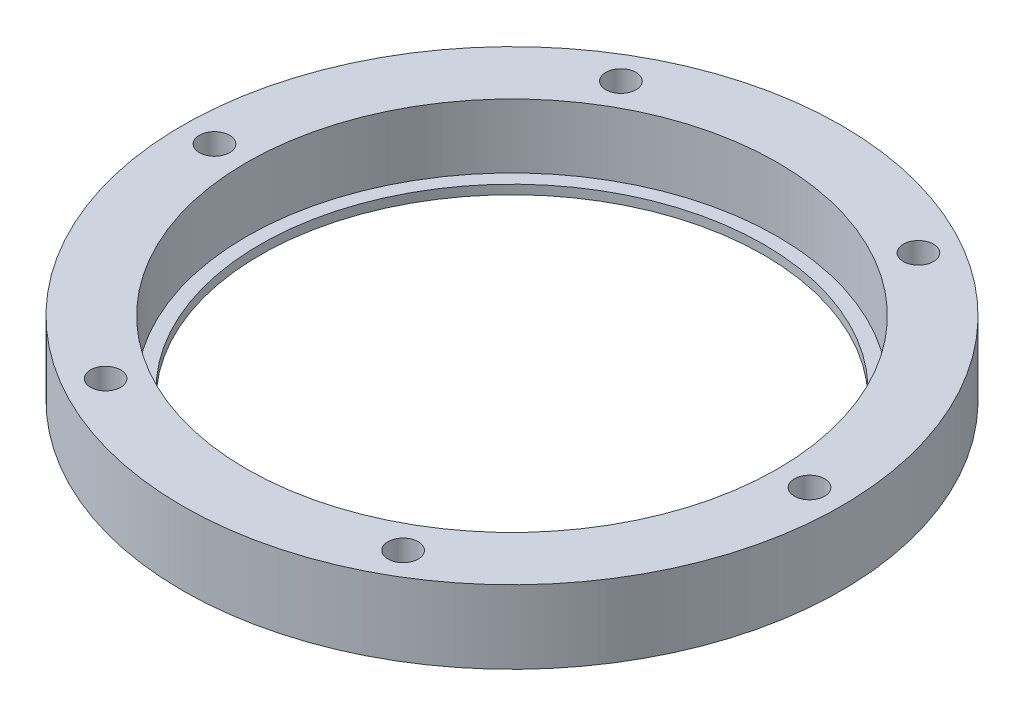
ISO-10303-21;
HEADER;
FILE_DESCRIPTION(('STEP AP214'),'2;1');
FILE_NAME('part.step','',(''),(''),'','','');
FILE_SCHEMA(('AUTOMOTIVE_DESIGN { 1 0 10303 214 1 1 1 1 }'));
ENDSEC;
DATA;
#1=APPLICATION_CONTEXT('core data for automotive mechanical design processes');
#2=APPLICATION_PROTOCOL_DEFINITION('international standard','automotive_design',2000,#1);
#3=PRODUCT_CONTEXT('',#1,'mechanical');
#4=PRODUCT('Part','Part','',(#3));
#5=PRODUCT_RELATED_PRODUCT_CATEGORY('part','',(#4));
#6=PRODUCT_DEFINITION_FORMATION('','',#4);
#7=PRODUCT_DEFINITION_CONTEXT('part definition',#1,'design');
#8=PRODUCT_DEFINITION('design','',#6,#7);
#9=PRODUCT_DEFINITION_SHAPE('','',#8);
#10=(LENGTH_UNIT() NAMED_UNIT(*) SI_UNIT(.MILLI.,.METRE.));
#11=(NAMED_UNIT(*) PLANE_ANGLE_UNIT() SI_UNIT($,.RADIAN.));
#12=(NAMED_UNIT(*) SI_UNIT($,.STERADIAN.) SOLID_ANGLE_UNIT());
#13=UNCERTAINTY_MEASURE_WITH_UNIT(LENGTH_MEASURE(1.E-05),#10,'distance_accuracy_value','');
#14=(GEOMETRIC_REPRESENTATION_CONTEXT(3) GLOBAL_UNCERTAINTY_ASSIGNED_CONTEXT((#13)) GLOBAL_UNIT_ASSIGNED_CONTEXT((#10,
#11,#12)) REPRESENTATION_CONTEXT('',''));
#15=CARTESIAN_POINT('',(0.,0.,0.));
#16=DIRECTION('',(0.,0.,1.));
#17=DIRECTION('',(1.,0.,0.));
#18=AXIS2_PLACEMENT_3D('',#15,#16,#17);
#19=CARTESIAN_POINT('',(0.,7.,0.));
#20=DIRECTION('',(0.,1.,0.));
#21=DIRECTION('',(0.,0.,1.));
#22=AXIS2_PLACEMENT_3D('',#19,#20,#21);
#23=PLANE('',#22);
#24=CARTESIAN_POINT('',(-16.25,7.,-28.1458256229943));
#25=DIRECTION('',(0.,1.,0.));
#26=DIRECTION('',(0.,0.,1.));
#27=AXIS2_PLACEMENT_3D('',#24,#25,#26);
#28=CIRCLE('',#27,1.64999999999999);
#29=CARTESIAN_POINT('',(-16.25,7.,-26.4958256229943));
#30=VERTEX_POINT('',#29);
#31=EDGE_CURVE('E95',#30,#30,#28,.T.);
#32=ORIENTED_EDGE('',*,*,#31,.F.);
#33=EDGE_LOOP('',(#32));
#34=FACE_BOUND('',#33,.T.);
#35=CARTESIAN_POINT('',(16.25,7.,-28.1458256229943));
#36=DIRECTION('',(0.,1.,0.));
#37=DIRECTION('',(0.,0.,1.));
#38=AXIS2_PLACEMENT_3D('',#35,#36,#37);
#39=CIRCLE('',#38,1.64999999999999);
#40=CARTESIAN_POINT('',(16.25,7.,-26.4958256229943));
#41=VERTEX_POINT('',#40);
#42=EDGE_CURVE('E89',#41,#41,#39,.T.);
#43=ORIENTED_EDGE('',*,*,#42,.F.);
#44=EDGE_LOOP('',(#43));
#45=FACE_BOUND('',#44,.T.);
#46=CARTESIAN_POINT('',(32.5,7.,0.));
#47=DIRECTION('',(0.,1.,0.));
#48=DIRECTION('',(0.,0.,1.));
#49=AXIS2_PLACEMENT_3D('',#46,#47,#48);
#50=CIRCLE('',#49,1.64999999999999);
#51=CARTESIAN_POINT('',(32.5,7.,1.64999999999998));
#52=VERTEX_POINT('',#51);
#53=EDGE_CURVE('E83',#52,#52,#50,.T.);
#54=ORIENTED_EDGE('',*,*,#53,.F.);
#55=EDGE_LOOP('',(#54));
#56=FACE_BOUND('',#55,.T.);
#57=CARTESIAN_POINT('',(16.25,7.,28.1458256229943));
#58=DIRECTION('',(0.,1.,0.));
#59=DIRECTION('',(0.,0.,1.));
#60=AXIS2_PLACEMENT_3D('',#57,#58,#59);
#61=CIRCLE('',#60,1.64999999999999);
#62=CARTESIAN_POINT('',(16.25,7.,29.7958256229942));
#63=VERTEX_POINT('',#62);
#64=EDGE_CURVE('E77',#63,#63,#61,.T.);
#65=ORIENTED_EDGE('',*,*,#64,.F.);
#66=EDGE_LOOP('',(#65));
#67=FACE_BOUND('',#66,.T.);
#68=CARTESIAN_POINT('',(-16.25,7.,28.1458256229943));
#69=DIRECTION('',(0.,1.,0.));
#70=DIRECTION('',(0.,0.,1.));
#71=AXIS2_PLACEMENT_3D('',#68,#69,#70);
#72=CIRCLE('',#71,1.64999999999999);
#73=CARTESIAN_POINT('',(-16.25,7.,29.7958256229943));
#74=VERTEX_POINT('',#73);
#75=EDGE_CURVE('E71',#74,#74,#72,.T.);
#76=ORIENTED_EDGE('',*,*,#75,.F.);
#77=EDGE_LOOP('',(#76));
#78=FACE_BOUND('',#77,.T.);
#79=CARTESIAN_POINT('',(-32.5,7.,0.));
#80=DIRECTION('',(0.,1.,0.));
#81=DIRECTION('',(0.,0.,1.));
#82=AXIS2_PLACEMENT_3D('',#79,#80,#81);
#83=CIRCLE('',#82,1.64999999999999);
#84=CARTESIAN_POINT('',(-32.5,7.,1.64999999999998));
#85=VERTEX_POINT('',#84);
#86=EDGE_CURVE('E65',#85,#85,#83,.T.);
#87=ORIENTED_EDGE('',*,*,#86,.F.);
#88=EDGE_LOOP('',(#87));
#89=FACE_BOUND('',#88,.T.);
#90=CARTESIAN_POINT('',(0.,7.,0.));
#91=DIRECTION('',(0.,1.,0.));
#92=DIRECTION('',(0.,0.,1.));
#93=AXIS2_PLACEMENT_3D('',#90,#91,#92);
#94=CIRCLE('',#93,36.);
#95=CARTESIAN_POINT('',(0.,7.,36.));
#96=VERTEX_POINT('',#95);
#97=EDGE_CURVE('E10',#96,#96,#94,.T.);
#98=ORIENTED_EDGE('',*,*,#97,.T.);
#99=EDGE_LOOP('',(#98));
#100=FACE_BOUND('',#99,.T.);
#101=CARTESIAN_POINT('',(0.,7.,0.));
#102=DIRECTION('',(0.,1.,0.));
#103=DIRECTION('',(0.,0.,1.));
#104=AXIS2_PLACEMENT_3D('',#101,#102,#103);
#105=CIRCLE('',#104,29.);
#106=CARTESIAN_POINT('',(0.,7.,29.));
#107=VERTEX_POINT('',#106);
#108=EDGE_CURVE('E43',#107,#107,#105,.T.);
#109=ORIENTED_EDGE('',*,*,#108,.F.);
#110=EDGE_LOOP('',(#109));
#111=FACE_BOUND('',#110,.T.);
#112=ADVANCED_FACE('F36',(#34,#45,#56,#67,#78,#89,#100,#111),#23,.T.);
#113=CARTESIAN_POINT('',(0.,7.,0.));
#114=DIRECTION('',(0.,-1.,0.));
#115=DIRECTION('',(0.,0.,-1.));
#116=AXIS2_PLACEMENT_3D('',#113,#114,#115);
#117=CYLINDRICAL_SURFACE('',#116,36.);
#118=ORIENTED_EDGE('',*,*,#97,.F.);
#119=EDGE_LOOP('',(#118));
#120=FACE_BOUND('',#119,.T.);
#121=CARTESIAN_POINT('',(0.,-1.,0.));
#122=DIRECTION('',(0.,-1.,0.));
#123=DIRECTION('',(0.,0.,-1.));
#124=AXIS2_PLACEMENT_3D('',#121,#122,#123);
#125=CIRCLE('',#124,36.);
#126=CARTESIAN_POINT('',(0.,-1.,-36.));
#127=VERTEX_POINT('',#126);
#128=EDGE_CURVE('E52',#127,#127,#125,.T.);
#129=ORIENTED_EDGE('',*,*,#128,.F.);
#130=EDGE_LOOP('',(#129));
#131=FACE_BOUND('',#130,.T.);
#132=ADVANCED_FACE('F38',(#120,#131),#117,.T.);
#133=CARTESIAN_POINT('',(0.,7.,0.));
#134=DIRECTION('',(0.,-1.,0.));
#135=DIRECTION('',(0.,0.,-1.));
#136=AXIS2_PLACEMENT_3D('',#133,#134,#135);
#137=CYLINDRICAL_SURFACE('',#136,29.);
#138=ORIENTED_EDGE('',*,*,#108,.T.);
#139=EDGE_LOOP('',(#138));
#140=FACE_BOUND('',#139,.T.);
#141=CARTESIAN_POINT('',(0.,0.,0.));
#142=DIRECTION('',(0.,1.,0.));
#143=DIRECTION('',(0.,0.,1.));
#144=AXIS2_PLACEMENT_3D('',#141,#142,#143);
#145=CIRCLE('',#144,29.);
#146=CARTESIAN_POINT('',(0.,0.,29.));
#147=VERTEX_POINT('',#146);
#148=EDGE_CURVE('E47',#147,#147,#145,.T.);
#149=ORIENTED_EDGE('',*,*,#148,.F.);
#150=EDGE_LOOP('',(#149));
#151=FACE_BOUND('',#150,.T.);
#152=ADVANCED_FACE('F139',(#140,#151),#137,.F.);
#153=CARTESIAN_POINT('',(0.,0.,0.));
#154=DIRECTION('',(0.,-1.,0.));
#155=DIRECTION('',(0.,0.,-1.));
#156=AXIS2_PLACEMENT_3D('',#153,#154,#155);
#157=PLANE('',#156);
#158=CARTESIAN_POINT('',(0.,0.,0.));
#159=DIRECTION('',(0.,-1.,0.));
#160=DIRECTION('',(0.,0.,-1.));
#161=AXIS2_PLACEMENT_3D('',#158,#159,#160);
#162=CIRCLE('',#161,27.5);
#163=CARTESIAN_POINT('',(0.,0.,-27.5));
#164=VERTEX_POINT('',#163);
#165=EDGE_CURVE('E57',#164,#164,#162,.T.);
#166=ORIENTED_EDGE('',*,*,#165,.T.);
#167=EDGE_LOOP('',(#166));
#168=FACE_BOUND('',#167,.T.);
#169=ORIENTED_EDGE('',*,*,#148,.T.);
#170=EDGE_LOOP('',(#169));
#171=FACE_BOUND('',#170,.T.);
#172=ADVANCED_FACE('F135',(#168,#171),#157,.F.);
#173=CARTESIAN_POINT('',(0.,-1.,0.));
#174=DIRECTION('',(0.,-1.,0.));
#175=DIRECTION('',(0.,0.,-1.));
#176=AXIS2_PLACEMENT_3D('',#173,#174,#175);
#177=PLANE('',#176);
#178=CARTESIAN_POINT('',(-16.25,-1.,-28.1458256229943));
#179=DIRECTION('',(0.,1.,0.));
#180=DIRECTION('',(0.,0.,1.));
#181=AXIS2_PLACEMENT_3D('',#178,#179,#180);
#182=CIRCLE('',#181,1.65);
#183=CARTESIAN_POINT('',(-16.25,-1.,-26.4958256229943));
#184=VERTEX_POINT('',#183);
#185=EDGE_CURVE('E92',#184,#184,#182,.T.);
#186=ORIENTED_EDGE('',*,*,#185,.T.);
#187=EDGE_LOOP('',(#186));
#188=FACE_BOUND('',#187,.T.);
#189=CARTESIAN_POINT('',(16.25,-1.,-28.1458256229943));
#190=DIRECTION('',(0.,1.,0.));
#191=DIRECTION('',(0.,0.,1.));
#192=AXIS2_PLACEMENT_3D('',#189,#190,#191);
#193=CIRCLE('',#192,1.65);
#194=CARTESIAN_POINT('',(16.25,-1.,-26.4958256229943));
#195=VERTEX_POINT('',#194);
#196=EDGE_CURVE('E86',#195,#195,#193,.T.);
#197=ORIENTED_EDGE('',*,*,#196,.T.);
#198=EDGE_LOOP('',(#197));
#199=FACE_BOUND('',#198,.T.);
#200=CARTESIAN_POINT('',(32.5,-1.,0.));
#201=DIRECTION('',(0.,1.,0.));
#202=DIRECTION('',(0.,0.,1.));
#203=AXIS2_PLACEMENT_3D('',#200,#201,#202);
#204=CIRCLE('',#203,1.65);
#205=CARTESIAN_POINT('',(32.5,-1.,1.64999999999999));
#206=VERTEX_POINT('',#205);
#207=EDGE_CURVE('E80',#206,#206,#204,.T.);
#208=ORIENTED_EDGE('',*,*,#207,.T.);
#209=EDGE_LOOP('',(#208));
#210=FACE_BOUND('',#209,.T.);
#211=CARTESIAN_POINT('',(16.25,-1.,28.1458256229943));
#212=DIRECTION('',(0.,1.,0.));
#213=DIRECTION('',(0.,0.,1.));
#214=AXIS2_PLACEMENT_3D('',#211,#212,#213);
#215=CIRCLE('',#214,1.65);
#216=CARTESIAN_POINT('',(16.25,-1.,29.7958256229943));
#217=VERTEX_POINT('',#216);
#218=EDGE_CURVE('E74',#217,#217,#215,.T.);
#219=ORIENTED_EDGE('',*,*,#218,.T.);
#220=EDGE_LOOP('',(#219));
#221=FACE_BOUND('',#220,.T.);
#222=CARTESIAN_POINT('',(-16.25,-1.,28.1458256229943));
#223=DIRECTION('',(0.,1.,0.));
#224=DIRECTION('',(0.,0.,1.));
#225=AXIS2_PLACEMENT_3D('',#222,#223,#224);
#226=CIRCLE('',#225,1.65);
#227=CARTESIAN_POINT('',(-16.25,-1.,29.7958256229943));
#228=VERTEX_POINT('',#227);
#229=EDGE_CURVE('E68',#228,#228,#226,.T.);
#230=ORIENTED_EDGE('',*,*,#229,.T.);
#231=EDGE_LOOP('',(#230));
#232=FACE_BOUND('',#231,.T.);
#233=CARTESIAN_POINT('',(-32.5,-1.,0.));
#234=DIRECTION('',(0.,1.,0.));
#235=DIRECTION('',(0.,0.,1.));
#236=AXIS2_PLACEMENT_3D('',#233,#234,#235);
#237=CIRCLE('',#236,1.65);
#238=CARTESIAN_POINT('',(-32.5,-1.,1.65));
#239=VERTEX_POINT('',#238);
#240=EDGE_CURVE('E60',#239,#239,#237,.T.);
#241=ORIENTED_EDGE('',*,*,#240,.T.);
#242=EDGE_LOOP('',(#241));
#243=FACE_BOUND('',#242,.T.);
#244=ORIENTED_EDGE('',*,*,#128,.T.);
#245=EDGE_LOOP('',(#244));
#246=FACE_BOUND('',#245,.T.);
#247=CARTESIAN_POINT('',(0.,-1.,0.));
#248=DIRECTION('',(0.,-1.,0.));
#249=DIRECTION('',(0.,0.,-1.));
#250=AXIS2_PLACEMENT_3D('',#247,#248,#249);
#251=CIRCLE('',#250,27.5);
#252=CARTESIAN_POINT('',(0.,-1.,-27.5));
#253=VERTEX_POINT('',#252);
#254=EDGE_CURVE('E56',#253,#253,#251,.T.);
#255=ORIENTED_EDGE('',*,*,#254,.F.);
#256=EDGE_LOOP('',(#255));
#257=FACE_BOUND('',#256,.T.);
#258=ADVANCED_FACE('F127',(#188,#199,#210,#221,#232,#243,#246,#257),#177,.T.);
#259=CARTESIAN_POINT('',(0.,-1.,0.));
#260=DIRECTION('',(0.,1.,0.));
#261=DIRECTION('',(0.,0.,1.));
#262=AXIS2_PLACEMENT_3D('',#259,#260,#261);
#263=CYLINDRICAL_SURFACE('',#262,27.5);
#264=ORIENTED_EDGE('',*,*,#254,.T.);
#265=EDGE_LOOP('',(#264));
#266=FACE_BOUND('',#265,.T.);
#267=ORIENTED_EDGE('',*,*,#165,.F.);
#268=EDGE_LOOP('',(#267));
#269=FACE_BOUND('',#268,.T.);
#270=ADVANCED_FACE('F117',(#266,#269),#263,.F.);
#271=CARTESIAN_POINT('',(-32.5,7.,0.));
#272=DIRECTION('',(0.,1.,0.));
#273=DIRECTION('',(0.,0.,1.));
#274=AXIS2_PLACEMENT_3D('',#271,#272,#273);
#275=CYLINDRICAL_SURFACE('',#274,1.64999999999999);
#276=ORIENTED_EDGE('',*,*,#240,.F.);
#277=EDGE_LOOP('',(#276));
#278=FACE_BOUND('',#277,.T.);
#279=ORIENTED_EDGE('',*,*,#86,.T.);
#280=EDGE_LOOP('',(#279));
#281=FACE_BOUND('',#280,.T.);
#282=ADVANCED_FACE('F114',(#278,#281),#275,.F.);
#283=CARTESIAN_POINT('',(-16.25,7.,28.1458256229943));
#284=DIRECTION('',(0.,1.,0.));
#285=DIRECTION('',(0.,0.,1.));
#286=AXIS2_PLACEMENT_3D('',#283,#284,#285);
#287=CYLINDRICAL_SURFACE('',#286,1.64999999999999);
#288=ORIENTED_EDGE('',*,*,#229,.F.);
#289=EDGE_LOOP('',(#288));
#290=FACE_BOUND('',#289,.T.);
#291=ORIENTED_EDGE('',*,*,#75,.T.);
#292=EDGE_LOOP('',(#291));
#293=FACE_BOUND('',#292,.T.);
#294=ADVANCED_FACE('F116',(#290,#293),#287,.F.);
#295=CARTESIAN_POINT('',(16.25,7.,28.1458256229943));
#296=DIRECTION('',(0.,1.,0.));
#297=DIRECTION('',(0.,0.,1.));
#298=AXIS2_PLACEMENT_3D('',#295,#296,#297);
#299=CYLINDRICAL_SURFACE('',#298,1.64999999999999);
#300=ORIENTED_EDGE('',*,*,#218,.F.);
#301=EDGE_LOOP('',(#300));
#302=FACE_BOUND('',#301,.T.);
#303=ORIENTED_EDGE('',*,*,#64,.T.);
#304=EDGE_LOOP('',(#303));
#305=FACE_BOUND('',#304,.T.);
#306=ADVANCED_FACE('F124',(#302,#305),#299,.F.);
#307=CARTESIAN_POINT('',(32.5,7.,0.));
#308=DIRECTION('',(0.,1.,0.));
#309=DIRECTION('',(0.,0.,1.));
#310=AXIS2_PLACEMENT_3D('',#307,#308,#309);
#311=CYLINDRICAL_SURFACE('',#310,1.65);
#312=ORIENTED_EDGE('',*,*,#207,.F.);
#313=EDGE_LOOP('',(#312));
#314=FACE_BOUND('',#313,.T.);
#315=ORIENTED_EDGE('',*,*,#53,.T.);
#316=EDGE_LOOP('',(#315));
#317=FACE_BOUND('',#316,.T.);
#318=ADVANCED_FACE('F197',(#314,#317),#311,.F.);
#319=CARTESIAN_POINT('',(16.25,7.,-28.1458256229943));
#320=DIRECTION('',(0.,1.,0.));
#321=DIRECTION('',(0.,0.,1.));
#322=AXIS2_PLACEMENT_3D('',#319,#320,#321);
#323=CYLINDRICAL_SURFACE('',#322,1.64999999999999);
#324=ORIENTED_EDGE('',*,*,#196,.F.);
#325=EDGE_LOOP('',(#324));
#326=FACE_BOUND('',#325,.T.);
#327=ORIENTED_EDGE('',*,*,#42,.T.);
#328=EDGE_LOOP('',(#327));
#329=FACE_BOUND('',#328,.T.);
#330=ADVANCED_FACE('F208',(#326,#329),#323,.F.);
#331=CARTESIAN_POINT('',(-16.25,7.,-28.1458256229943));
#332=DIRECTION('',(0.,1.,0.));
#333=DIRECTION('',(0.,0.,1.));
#334=AXIS2_PLACEMENT_3D('',#331,#332,#333);
#335=CYLINDRICAL_SURFACE('',#334,1.64999999999999);
#336=ORIENTED_EDGE('',*,*,#185,.F.);
#337=EDGE_LOOP('',(#336));
#338=FACE_BOUND('',#337,.T.);
#339=ORIENTED_EDGE('',*,*,#31,.T.);
#340=EDGE_LOOP('',(#339));
#341=FACE_BOUND('',#340,.T.);
#342=ADVANCED_FACE('F99',(#338,#341),#335,.F.);
#343=CLOSED_SHELL('',(#112,#132,#152,#172,#258,#270,#282,#294,#306,#318,#330,#342));
#344=MANIFOLD_SOLID_BREP('B2',#343);
#345=ADVANCED_BREP_SHAPE_REPRESENTATION('',(#18,#344),#14);
#346=SHAPE_DEFINITION_REPRESENTATION(#9,#345);
ENDSEC;
END-ISO-10303-21;
